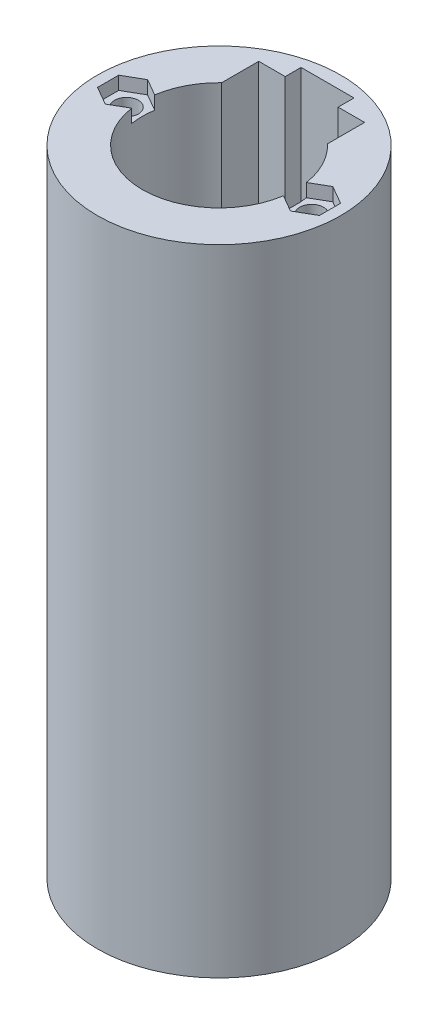
ISO-10303-21;
HEADER;
FILE_DESCRIPTION(('STEP AP214'),'2;1');
FILE_NAME('part.step','',(''),(''),'','','');
FILE_SCHEMA(('AUTOMOTIVE_DESIGN { 1 0 10303 214 1 1 1 1 }'));
ENDSEC;
DATA;
#1=APPLICATION_CONTEXT('core data for automotive mechanical design processes');
#2=APPLICATION_PROTOCOL_DEFINITION('international standard','automotive_design',2000,#1);
#3=PRODUCT_CONTEXT('',#1,'mechanical');
#4=PRODUCT('Part','Part','',(#3));
#5=PRODUCT_RELATED_PRODUCT_CATEGORY('part','',(#4));
#6=PRODUCT_DEFINITION_FORMATION('','',#4);
#7=PRODUCT_DEFINITION_CONTEXT('part definition',#1,'design');
#8=PRODUCT_DEFINITION('design','',#6,#7);
#9=PRODUCT_DEFINITION_SHAPE('','',#8);
#10=(LENGTH_UNIT() NAMED_UNIT(*) SI_UNIT(.MILLI.,.METRE.));
#11=(NAMED_UNIT(*) PLANE_ANGLE_UNIT() SI_UNIT($,.RADIAN.));
#12=(NAMED_UNIT(*) SI_UNIT($,.STERADIAN.) SOLID_ANGLE_UNIT());
#13=UNCERTAINTY_MEASURE_WITH_UNIT(LENGTH_MEASURE(1.E-05),#10,'distance_accuracy_value','');
#14=(GEOMETRIC_REPRESENTATION_CONTEXT(3) GLOBAL_UNCERTAINTY_ASSIGNED_CONTEXT((#13)) GLOBAL_UNIT_ASSIGNED_CONTEXT((#10,
#11,#12)) REPRESENTATION_CONTEXT('',''));
#15=CARTESIAN_POINT('',(0.,0.,0.));
#16=DIRECTION('',(0.,0.,1.));
#17=DIRECTION('',(1.,0.,0.));
#18=AXIS2_PLACEMENT_3D('',#15,#16,#17);
#19=CARTESIAN_POINT('',(-10.,95.,-17.5));
#20=DIRECTION('',(0.,0.,-1.));
#21=DIRECTION('',(-1.,0.,0.));
#22=AXIS2_PLACEMENT_3D('',#19,#20,#21);
#23=PLANE('',#22);
#24=DIRECTION('',(-1.,0.,0.));
#25=VECTOR('',#24,1.);
#26=CARTESIAN_POINT('',(-10.,95.,-17.5));
#27=LINE('',#26,#25);
#28=CARTESIAN_POINT('',(-5.,95.,-17.5));
#29=VERTEX_POINT('',#28);
#30=CARTESIAN_POINT('',(-10.,95.,-17.5));
#31=VERTEX_POINT('',#30);
#32=EDGE_CURVE('E197',#29,#31,#27,.T.);
#33=ORIENTED_EDGE('',*,*,#32,.F.);
#34=DIRECTION('',(0.,1.,0.));
#35=VECTOR('',#34,1.);
#36=CARTESIAN_POINT('',(-5.,95.,-17.5));
#37=LINE('',#36,#35);
#38=CARTESIAN_POINT('',(-5.,120.,-17.5));
#39=VERTEX_POINT('',#38);
#40=EDGE_CURVE('E207',#29,#39,#37,.T.);
#41=ORIENTED_EDGE('',*,*,#40,.T.);
#42=DIRECTION('',(-1.,0.,0.));
#43=VECTOR('',#42,1.);
#44=CARTESIAN_POINT('',(-10.,120.,-17.5));
#45=LINE('',#44,#43);
#46=CARTESIAN_POINT('',(-10.,120.,-17.5));
#47=VERTEX_POINT('',#46);
#48=EDGE_CURVE('E206',#39,#47,#45,.T.);
#49=ORIENTED_EDGE('',*,*,#48,.T.);
#50=DIRECTION('',(0.,1.,0.));
#51=VECTOR('',#50,1.);
#52=CARTESIAN_POINT('',(-10.,95.,-17.5));
#53=LINE('',#52,#51);
#54=EDGE_CURVE('E216',#31,#47,#53,.T.);
#55=ORIENTED_EDGE('',*,*,#54,.F.);
#56=EDGE_LOOP('',(#33,#41,#49,#55));
#57=FACE_BOUND('',#56,.T.);
#58=ADVANCED_FACE('F33',(#57),#23,.F.);
#59=CARTESIAN_POINT('',(0.,0.,0.));
#60=DIRECTION('',(0.,1.,0.));
#61=DIRECTION('',(0.,0.,1.));
#62=AXIS2_PLACEMENT_3D('',#59,#60,#61);
#63=CYLINDRICAL_SURFACE('',#62,14.5);
#64=CARTESIAN_POINT('',(0.,95.,0.));
#65=DIRECTION('',(0.,-1.,0.));
#66=DIRECTION('',(0.,0.,1.));
#67=AXIS2_PLACEMENT_3D('',#64,#65,#66);
#68=CIRCLE('',#67,14.5);
#69=CARTESIAN_POINT('',(-10.,95.,-10.5));
#70=VERTEX_POINT('',#69);
#71=CARTESIAN_POINT('',(10.,95.,-10.5));
#72=VERTEX_POINT('',#71);
#73=EDGE_CURVE('E211',#70,#72,#68,.T.);
#74=ORIENTED_EDGE('',*,*,#73,.F.);
#75=DIRECTION('',(0.,1.,0.));
#76=VECTOR('',#75,1.);
#77=CARTESIAN_POINT('',(-10.,95.,-10.5));
#78=LINE('',#77,#76);
#79=CARTESIAN_POINT('',(-10.,120.,-10.5));
#80=VERTEX_POINT('',#79);
#81=EDGE_CURVE('E212',#70,#80,#78,.T.);
#82=ORIENTED_EDGE('',*,*,#81,.T.);
#83=CARTESIAN_POINT('',(0.,120.,0.));
#84=DIRECTION('',(0.,1.,0.));
#85=DIRECTION('',(0.,0.,1.));
#86=AXIS2_PLACEMENT_3D('',#83,#84,#85);
#87=CIRCLE('',#86,14.5);
#88=CARTESIAN_POINT('',(-14.3361933401723,120.,-2.17337537328456));
#89=VERTEX_POINT('',#88);
#90=EDGE_CURVE('E300',#80,#89,#87,.T.);
#91=ORIENTED_EDGE('',*,*,#90,.T.);
#92=DIRECTION('',(0.,1.,0.));
#93=VECTOR('',#92,1.);
#94=CARTESIAN_POINT('',(-14.3361933401723,0.,-2.17337537328456));
#95=LINE('',#94,#93);
#96=CARTESIAN_POINT('',(-14.3361933401723,117.5,-2.17337537328456));
#97=VERTEX_POINT('',#96);
#98=EDGE_CURVE('E322',#89,#97,#95,.F.);
#99=ORIENTED_EDGE('',*,*,#98,.T.);
#100=CARTESIAN_POINT('',(0.,117.5,0.));
#101=DIRECTION('',(0.,1.,0.));
#102=DIRECTION('',(0.,0.,1.));
#103=AXIS2_PLACEMENT_3D('',#100,#101,#102);
#104=CIRCLE('',#103,14.5);
#105=CARTESIAN_POINT('',(-14.3361933401723,117.5,2.17337537328456));
#106=VERTEX_POINT('',#105);
#107=EDGE_CURVE('E315',#106,#97,#104,.F.);
#108=ORIENTED_EDGE('',*,*,#107,.F.);
#109=DIRECTION('',(0.,1.,0.));
#110=VECTOR('',#109,1.);
#111=CARTESIAN_POINT('',(-14.3361933401723,0.,2.17337537328456));
#112=LINE('',#111,#110);
#113=CARTESIAN_POINT('',(-14.3361933401723,120.,2.17337537328456));
#114=VERTEX_POINT('',#113);
#115=EDGE_CURVE('E319',#106,#114,#112,.T.);
#116=ORIENTED_EDGE('',*,*,#115,.T.);
#117=CARTESIAN_POINT('',(14.3361933401723,120.,2.17337537328456));
#118=VERTEX_POINT('',#117);
#119=EDGE_CURVE('E307',#114,#118,#87,.T.);
#120=ORIENTED_EDGE('',*,*,#119,.T.);
#121=DIRECTION('',(0.,1.,0.));
#122=VECTOR('',#121,1.);
#123=CARTESIAN_POINT('',(14.3361933401723,0.,2.17337537328456));
#124=LINE('',#123,#122);
#125=CARTESIAN_POINT('',(14.3361933401723,117.5,2.17337537328456));
#126=VERTEX_POINT('',#125);
#127=EDGE_CURVE('E328',#118,#126,#124,.F.);
#128=ORIENTED_EDGE('',*,*,#127,.T.);
#129=CARTESIAN_POINT('',(0.,117.5,0.));
#130=DIRECTION('',(0.,-1.,0.));
#131=DIRECTION('',(0.,0.,-1.));
#132=AXIS2_PLACEMENT_3D('',#129,#130,#131);
#133=CIRCLE('',#132,14.5);
#134=CARTESIAN_POINT('',(14.3361933401723,117.5,-2.17337537328456));
#135=VERTEX_POINT('',#134);
#136=EDGE_CURVE('E325',#126,#135,#133,.F.);
#137=ORIENTED_EDGE('',*,*,#136,.T.);
#138=DIRECTION('',(0.,1.,0.));
#139=VECTOR('',#138,1.);
#140=CARTESIAN_POINT('',(14.3361933401723,0.,-2.17337537328456));
#141=LINE('',#140,#139);
#142=CARTESIAN_POINT('',(14.3361933401723,120.,-2.17337537328456));
#143=VERTEX_POINT('',#142);
#144=EDGE_CURVE('E42',#135,#143,#141,.T.);
#145=ORIENTED_EDGE('',*,*,#144,.T.);
#146=CARTESIAN_POINT('',(10.,120.,-10.5));
#147=VERTEX_POINT('',#146);
#148=EDGE_CURVE('E311',#143,#147,#87,.T.);
#149=ORIENTED_EDGE('',*,*,#148,.T.);
#150=DIRECTION('',(0.,1.,0.));
#151=VECTOR('',#150,1.);
#152=CARTESIAN_POINT('',(10.,95.,-10.5));
#153=LINE('',#152,#151);
#154=EDGE_CURVE('E57',#72,#147,#153,.T.);
#155=ORIENTED_EDGE('',*,*,#154,.F.);
#156=EDGE_LOOP('',(#74,#82,#91,#99,#108,#116,#120,#128,#137,#145,#149,#155));
#157=FACE_BOUND('',#156,.T.);
#158=CARTESIAN_POINT('',(0.,7.,0.));
#159=DIRECTION('',(0.,-1.,0.));
#160=DIRECTION('',(0.,0.,-1.));
#161=AXIS2_PLACEMENT_3D('',#158,#159,#160);
#162=CIRCLE('',#161,14.5);
#163=CARTESIAN_POINT('',(0.,7.,-14.5));
#164=VERTEX_POINT('',#163);
#165=EDGE_CURVE('E11',#164,#164,#162,.F.);
#166=ORIENTED_EDGE('',*,*,#165,.F.);
#167=EDGE_LOOP('',(#166));
#168=FACE_BOUND('',#167,.T.);
#169=ADVANCED_FACE('F337',(#157,#168),#63,.F.);
#170=CARTESIAN_POINT('',(0.,120.,0.));
#171=DIRECTION('',(0.,-1.,0.));
#172=DIRECTION('',(0.,0.,-1.));
#173=AXIS2_PLACEMENT_3D('',#170,#171,#172);
#174=CYLINDRICAL_SURFACE('',#173,23.);
#175=CARTESIAN_POINT('',(0.,120.,0.));
#176=DIRECTION('',(0.,1.,0.));
#177=DIRECTION('',(0.,0.,1.));
#178=AXIS2_PLACEMENT_3D('',#175,#176,#177);
#179=CIRCLE('',#178,23.);
#180=CARTESIAN_POINT('',(0.,120.,23.));
#181=VERTEX_POINT('',#180);
#182=EDGE_CURVE('E312',#181,#181,#179,.T.);
#183=ORIENTED_EDGE('',*,*,#182,.F.);
#184=EDGE_LOOP('',(#183));
#185=FACE_BOUND('',#184,.T.);
#186=CARTESIAN_POINT('',(0.,0.,0.));
#187=DIRECTION('',(0.,1.,0.));
#188=DIRECTION('',(0.,0.,1.));
#189=AXIS2_PLACEMENT_3D('',#186,#187,#188);
#190=CIRCLE('',#189,23.);
#191=CARTESIAN_POINT('',(0.,0.,23.));
#192=VERTEX_POINT('',#191);
#193=EDGE_CURVE('E310',#192,#192,#190,.T.);
#194=ORIENTED_EDGE('',*,*,#193,.T.);
#195=EDGE_LOOP('',(#194));
#196=FACE_BOUND('',#195,.T.);
#197=ADVANCED_FACE('F35',(#185,#196),#174,.T.);
#198=CARTESIAN_POINT('',(0.,120.,0.));
#199=DIRECTION('',(0.,1.,0.));
#200=DIRECTION('',(0.,0.,1.));
#201=AXIS2_PLACEMENT_3D('',#198,#199,#200);
#202=PLANE('',#201);
#203=DIRECTION('',(0.,0.,1.));
#204=VECTOR('',#203,1.);
#205=CARTESIAN_POINT('',(-5.,120.,-17.5));
#206=LINE('',#205,#204);
#207=CARTESIAN_POINT('',(-5.,120.,-20.5));
#208=VERTEX_POINT('',#207);
#209=EDGE_CURVE('E182',#208,#39,#206,.T.);
#210=ORIENTED_EDGE('',*,*,#209,.F.);
#211=DIRECTION('',(-1.,0.,0.));
#212=VECTOR('',#211,1.);
#213=CARTESIAN_POINT('',(-5.,120.,-20.5));
#214=LINE('',#213,#212);
#215=CARTESIAN_POINT('',(5.,120.,-20.5));
#216=VERTEX_POINT('',#215);
#217=EDGE_CURVE('E442',#216,#208,#214,.T.);
#218=ORIENTED_EDGE('',*,*,#217,.F.);
#219=DIRECTION('',(0.,0.,-1.));
#220=VECTOR('',#219,1.);
#221=CARTESIAN_POINT('',(5.,120.,-20.5));
#222=LINE('',#221,#220);
#223=CARTESIAN_POINT('',(5.,120.,-17.5));
#224=VERTEX_POINT('',#223);
#225=EDGE_CURVE('E451',#224,#216,#222,.T.);
#226=ORIENTED_EDGE('',*,*,#225,.F.);
#227=CARTESIAN_POINT('',(10.,120.,-17.5));
#228=VERTEX_POINT('',#227);
#229=EDGE_CURVE('E191',#228,#224,#45,.T.);
#230=ORIENTED_EDGE('',*,*,#229,.F.);
#231=DIRECTION('',(0.,0.,-1.));
#232=VECTOR('',#231,1.);
#233=CARTESIAN_POINT('',(10.,120.,-17.5));
#234=LINE('',#233,#232);
#235=EDGE_CURVE('E204',#147,#228,#234,.T.);
#236=ORIENTED_EDGE('',*,*,#235,.F.);
#237=ORIENTED_EDGE('',*,*,#148,.F.);
#238=DIRECTION('',(-0.866025403784439,0.,0.499999999999999));
#239=VECTOR('',#238,1.);
#240=CARTESIAN_POINT('',(14.0358983848622,120.,-2.));
#241=LINE('',#240,#239);
#242=CARTESIAN_POINT('',(17.5,120.,-4.));
#243=VERTEX_POINT('',#242);
#244=EDGE_CURVE('E240',#243,#143,#241,.T.);
#245=ORIENTED_EDGE('',*,*,#244,.F.);
#246=DIRECTION('',(-0.866025403784438,0.,-0.500000000000001));
#247=VECTOR('',#246,1.);
#248=CARTESIAN_POINT('',(17.5,120.,-4.));
#249=LINE('',#248,#247);
#250=CARTESIAN_POINT('',(20.9641016151377,120.,-1.99999999999998));
#251=VERTEX_POINT('',#250);
#252=EDGE_CURVE('E259',#251,#243,#249,.T.);
#253=ORIENTED_EDGE('',*,*,#252,.F.);
#254=DIRECTION('',(0.,0.,-1.));
#255=VECTOR('',#254,1.);
#256=CARTESIAN_POINT('',(20.9641016151377,120.,-1.99999999999998));
#257=LINE('',#256,#255);
#258=CARTESIAN_POINT('',(20.9641016151377,120.,2.00000000000001));
#259=VERTEX_POINT('',#258);
#260=EDGE_CURVE('E256',#259,#251,#257,.T.);
#261=ORIENTED_EDGE('',*,*,#260,.F.);
#262=DIRECTION('',(0.866025403784439,0.,-0.499999999999999));
#263=VECTOR('',#262,1.);
#264=CARTESIAN_POINT('',(20.9641016151377,120.,2.00000000000001));
#265=LINE('',#264,#263);
#266=CARTESIAN_POINT('',(17.5,120.,4.00000000000001));
#267=VERTEX_POINT('',#266);
#268=EDGE_CURVE('E253',#267,#259,#265,.T.);
#269=ORIENTED_EDGE('',*,*,#268,.F.);
#270=DIRECTION('',(0.866025403784438,0.,0.500000000000001));
#271=VECTOR('',#270,1.);
#272=CARTESIAN_POINT('',(17.5,120.,4.00000000000001));
#273=LINE('',#272,#271);
#274=EDGE_CURVE('E234',#118,#267,#273,.T.);
#275=ORIENTED_EDGE('',*,*,#274,.F.);
#276=ORIENTED_EDGE('',*,*,#119,.F.);
#277=DIRECTION('',(0.866025403784438,0.,-0.500000000000001));
#278=VECTOR('',#277,1.);
#279=CARTESIAN_POINT('',(-17.5,120.,4.00000000000001));
#280=LINE('',#279,#278);
#281=CARTESIAN_POINT('',(-17.5,120.,4.00000000000001));
#282=VERTEX_POINT('',#281);
#283=EDGE_CURVE('E292',#282,#114,#280,.T.);
#284=ORIENTED_EDGE('',*,*,#283,.F.);
#285=DIRECTION('',(0.866025403784439,0.,0.499999999999999));
#286=VECTOR('',#285,1.);
#287=CARTESIAN_POINT('',(-20.9641016151377,120.,2.00000000000001));
#288=LINE('',#287,#286);
#289=CARTESIAN_POINT('',(-20.9641016151377,120.,2.00000000000001));
#290=VERTEX_POINT('',#289);
#291=EDGE_CURVE('E289',#290,#282,#288,.T.);
#292=ORIENTED_EDGE('',*,*,#291,.F.);
#293=DIRECTION('',(0.,0.,1.));
#294=VECTOR('',#293,1.);
#295=CARTESIAN_POINT('',(-20.9641016151377,120.,-1.99999999999998));
#296=LINE('',#295,#294);
#297=CARTESIAN_POINT('',(-20.9641016151377,120.,-1.99999999999998));
#298=VERTEX_POINT('',#297);
#299=EDGE_CURVE('E265',#298,#290,#296,.T.);
#300=ORIENTED_EDGE('',*,*,#299,.F.);
#301=DIRECTION('',(-0.866025403784438,0.,0.500000000000001));
#302=VECTOR('',#301,1.);
#303=CARTESIAN_POINT('',(-17.5,120.,-4.));
#304=LINE('',#303,#302);
#305=CARTESIAN_POINT('',(-17.5,120.,-4.));
#306=VERTEX_POINT('',#305);
#307=EDGE_CURVE('E276',#306,#298,#304,.T.);
#308=ORIENTED_EDGE('',*,*,#307,.F.);
#309=DIRECTION('',(-0.866025403784439,0.,-0.499999999999999));
#310=VECTOR('',#309,1.);
#311=CARTESIAN_POINT('',(-14.0358983848622,120.,-2.));
#312=LINE('',#311,#310);
#313=EDGE_CURVE('E294',#89,#306,#312,.T.);
#314=ORIENTED_EDGE('',*,*,#313,.F.);
#315=ORIENTED_EDGE('',*,*,#90,.F.);
#316=DIRECTION('',(0.,0.,1.));
#317=VECTOR('',#316,1.);
#318=CARTESIAN_POINT('',(-10.,120.,-10.5));
#319=LINE('',#318,#317);
#320=EDGE_CURVE('E209',#47,#80,#319,.T.);
#321=ORIENTED_EDGE('',*,*,#320,.F.);
#322=ORIENTED_EDGE('',*,*,#48,.F.);
#323=EDGE_LOOP('',(#210,#218,#226,#230,#236,#237,#245,#253,#261,#269,#275,#276,#284,#292,#300,
#308,#314,#315,#321,#322));
#324=FACE_BOUND('',#323,.T.);
#325=ORIENTED_EDGE('',*,*,#182,.T.);
#326=EDGE_LOOP('',(#325));
#327=FACE_BOUND('',#326,.T.);
#328=ADVANCED_FACE('F344',(#324,#327),#202,.T.);
#329=CARTESIAN_POINT('',(0.,0.,0.));
#330=DIRECTION('',(0.,1.,0.));
#331=DIRECTION('',(0.,0.,1.));
#332=AXIS2_PLACEMENT_3D('',#329,#330,#331);
#333=PLANE('',#332);
#334=CARTESIAN_POINT('',(0.,0.,0.));
#335=DIRECTION('',(0.,-1.,0.));
#336=DIRECTION('',(0.,0.,-1.));
#337=AXIS2_PLACEMENT_3D('',#334,#335,#336);
#338=CIRCLE('',#337,4.);
#339=CARTESIAN_POINT('',(0.,0.,-4.));
#340=VERTEX_POINT('',#339);
#341=EDGE_CURVE('E215',#340,#340,#338,.T.);
#342=ORIENTED_EDGE('',*,*,#341,.F.);
#343=EDGE_LOOP('',(#342));
#344=FACE_BOUND('',#343,.T.);
#345=ORIENTED_EDGE('',*,*,#193,.F.);
#346=EDGE_LOOP('',(#345));
#347=FACE_BOUND('',#346,.T.);
#348=ADVANCED_FACE('F490',(#344,#347),#333,.F.);
#349=CARTESIAN_POINT('',(-14.0358983848622,117.5,-2.));
#350=DIRECTION('',(0.499999999999999,0.,-0.866025403784439));
#351=DIRECTION('',(-0.866025403784439,0.,-0.499999999999999));
#352=AXIS2_PLACEMENT_3D('',#349,#350,#351);
#353=PLANE('',#352);
#354=ORIENTED_EDGE('',*,*,#313,.T.);
#355=DIRECTION('',(0.,1.,0.));
#356=VECTOR('',#355,1.);
#357=CARTESIAN_POINT('',(-17.5,117.5,-4.));
#358=LINE('',#357,#356);
#359=CARTESIAN_POINT('',(-17.5,117.5,-4.));
#360=VERTEX_POINT('',#359);
#361=EDGE_CURVE('E301',#360,#306,#358,.T.);
#362=ORIENTED_EDGE('',*,*,#361,.F.);
#363=DIRECTION('',(-0.866025403784439,0.,-0.499999999999999));
#364=VECTOR('',#363,1.);
#365=CARTESIAN_POINT('',(-14.0358983848622,117.5,-2.));
#366=LINE('',#365,#364);
#367=EDGE_CURVE('E281',#97,#360,#366,.T.);
#368=ORIENTED_EDGE('',*,*,#367,.F.);
#369=ORIENTED_EDGE('',*,*,#98,.F.);
#370=EDGE_LOOP('',(#354,#362,#368,#369));
#371=FACE_BOUND('',#370,.T.);
#372=ADVANCED_FACE('F354',(#371),#353,.F.);
#373=CARTESIAN_POINT('',(-17.5,117.5,4.00000000000001));
#374=DIRECTION('',(0.500000000000001,0.,0.866025403784438));
#375=DIRECTION('',(0.866025403784438,0.,-0.500000000000001));
#376=AXIS2_PLACEMENT_3D('',#373,#374,#375);
#377=PLANE('',#376);
#378=DIRECTION('',(0.866025403784438,0.,-0.500000000000001));
#379=VECTOR('',#378,1.);
#380=CARTESIAN_POINT('',(-17.5,117.5,4.00000000000001));
#381=LINE('',#380,#379);
#382=CARTESIAN_POINT('',(-17.5,117.5,4.00000000000001));
#383=VERTEX_POINT('',#382);
#384=EDGE_CURVE('E279',#383,#106,#381,.T.);
#385=ORIENTED_EDGE('',*,*,#384,.F.);
#386=DIRECTION('',(0.,1.,0.));
#387=VECTOR('',#386,1.);
#388=CARTESIAN_POINT('',(-17.5,117.5,4.00000000000001));
#389=LINE('',#388,#387);
#390=EDGE_CURVE('E304',#383,#282,#389,.T.);
#391=ORIENTED_EDGE('',*,*,#390,.T.);
#392=ORIENTED_EDGE('',*,*,#283,.T.);
#393=ORIENTED_EDGE('',*,*,#115,.F.);
#394=EDGE_LOOP('',(#385,#391,#392,#393));
#395=FACE_BOUND('',#394,.T.);
#396=ADVANCED_FACE('F639',(#395),#377,.F.);
#397=CARTESIAN_POINT('',(0.,117.5,0.));
#398=DIRECTION('',(0.,1.,0.));
#399=DIRECTION('',(0.,0.,1.));
#400=AXIS2_PLACEMENT_3D('',#397,#398,#399);
#401=PLANE('',#400);
#402=CARTESIAN_POINT('',(-17.5,117.5,0.));
#403=DIRECTION('',(0.,1.,0.));
#404=DIRECTION('',(0.,0.,1.));
#405=AXIS2_PLACEMENT_3D('',#402,#403,#404);
#406=CIRCLE('',#405,2.25);
#407=CARTESIAN_POINT('',(-17.5,117.5,2.24999999999999));
#408=VERTEX_POINT('',#407);
#409=EDGE_CURVE('E227',#408,#408,#406,.T.);
#410=ORIENTED_EDGE('',*,*,#409,.F.);
#411=EDGE_LOOP('',(#410));
#412=FACE_BOUND('',#411,.T.);
#413=ORIENTED_EDGE('',*,*,#107,.T.);
#414=ORIENTED_EDGE('',*,*,#367,.T.);
#415=DIRECTION('',(-0.866025403784438,0.,0.500000000000001));
#416=VECTOR('',#415,1.);
#417=CARTESIAN_POINT('',(-17.5,117.5,-4.));
#418=LINE('',#417,#416);
#419=CARTESIAN_POINT('',(-20.9641016151377,117.5,-1.99999999999998));
#420=VERTEX_POINT('',#419);
#421=EDGE_CURVE('E283',#360,#420,#418,.T.);
#422=ORIENTED_EDGE('',*,*,#421,.T.);
#423=DIRECTION('',(0.,0.,1.));
#424=VECTOR('',#423,1.);
#425=CARTESIAN_POINT('',(-20.9641016151377,117.5,-1.99999999999998));
#426=LINE('',#425,#424);
#427=CARTESIAN_POINT('',(-20.9641016151377,117.5,2.00000000000001));
#428=VERTEX_POINT('',#427);
#429=EDGE_CURVE('E272',#420,#428,#426,.T.);
#430=ORIENTED_EDGE('',*,*,#429,.T.);
#431=DIRECTION('',(0.866025403784439,0.,0.499999999999999));
#432=VECTOR('',#431,1.);
#433=CARTESIAN_POINT('',(-20.9641016151377,117.5,2.00000000000001));
#434=LINE('',#433,#432);
#435=EDGE_CURVE('E275',#428,#383,#434,.T.);
#436=ORIENTED_EDGE('',*,*,#435,.T.);
#437=ORIENTED_EDGE('',*,*,#384,.T.);
#438=EDGE_LOOP('',(#413,#414,#422,#430,#436,#437));
#439=FACE_BOUND('',#438,.T.);
#440=ADVANCED_FACE('F364',(#412,#439),#401,.T.);
#441=CARTESIAN_POINT('',(-20.9641016151377,117.5,-1.99999999999998));
#442=DIRECTION('',(-1.,0.,0.));
#443=DIRECTION('',(0.,0.,1.));
#444=AXIS2_PLACEMENT_3D('',#441,#442,#443);
#445=PLANE('',#444);
#446=ORIENTED_EDGE('',*,*,#299,.T.);
#447=DIRECTION('',(0.,1.,0.));
#448=VECTOR('',#447,1.);
#449=CARTESIAN_POINT('',(-20.9641016151377,117.5,2.00000000000001));
#450=LINE('',#449,#448);
#451=EDGE_CURVE('E286',#428,#290,#450,.T.);
#452=ORIENTED_EDGE('',*,*,#451,.F.);
#453=ORIENTED_EDGE('',*,*,#429,.F.);
#454=DIRECTION('',(0.,1.,0.));
#455=VECTOR('',#454,1.);
#456=CARTESIAN_POINT('',(-20.9641016151377,117.5,-1.99999999999998));
#457=LINE('',#456,#455);
#458=EDGE_CURVE('E298',#420,#298,#457,.T.);
#459=ORIENTED_EDGE('',*,*,#458,.T.);
#460=EDGE_LOOP('',(#446,#452,#453,#459));
#461=FACE_BOUND('',#460,.T.);
#462=ADVANCED_FACE('F623',(#461),#445,.F.);
#463=CARTESIAN_POINT('',(-17.5,117.5,-4.));
#464=DIRECTION('',(-0.500000000000001,0.,-0.866025403784438));
#465=DIRECTION('',(-0.866025403784438,0.,0.500000000000001));
#466=AXIS2_PLACEMENT_3D('',#463,#464,#465);
#467=PLANE('',#466);
#468=ORIENTED_EDGE('',*,*,#307,.T.);
#469=ORIENTED_EDGE('',*,*,#458,.F.);
#470=ORIENTED_EDGE('',*,*,#421,.F.);
#471=ORIENTED_EDGE('',*,*,#361,.T.);
#472=EDGE_LOOP('',(#468,#469,#470,#471));
#473=FACE_BOUND('',#472,.T.);
#474=ADVANCED_FACE('F360',(#473),#467,.F.);
#475=CARTESIAN_POINT('',(-20.9641016151377,117.5,2.00000000000001));
#476=DIRECTION('',(-0.499999999999999,0.,0.866025403784439));
#477=DIRECTION('',(0.866025403784439,0.,0.499999999999999));
#478=AXIS2_PLACEMENT_3D('',#475,#476,#477);
#479=PLANE('',#478);
#480=ORIENTED_EDGE('',*,*,#291,.T.);
#481=ORIENTED_EDGE('',*,*,#390,.F.);
#482=ORIENTED_EDGE('',*,*,#435,.F.);
#483=ORIENTED_EDGE('',*,*,#451,.T.);
#484=EDGE_LOOP('',(#480,#481,#482,#483));
#485=FACE_BOUND('',#484,.T.);
#486=ADVANCED_FACE('F607',(#485),#479,.F.);
#487=CARTESIAN_POINT('',(14.0358983848622,117.5,-2.));
#488=DIRECTION('',(-0.499999999999999,0.,-0.866025403784439));
#489=DIRECTION('',(-0.866025403784439,0.,0.499999999999999));
#490=AXIS2_PLACEMENT_3D('',#487,#488,#489);
#491=PLANE('',#490);
#492=DIRECTION('',(-0.866025403784439,0.,0.499999999999999));
#493=VECTOR('',#492,1.);
#494=CARTESIAN_POINT('',(14.0358983848622,117.5,-2.));
#495=LINE('',#494,#493);
#496=CARTESIAN_POINT('',(17.5,117.5,-4.));
#497=VERTEX_POINT('',#496);
#498=EDGE_CURVE('E249',#497,#135,#495,.T.);
#499=ORIENTED_EDGE('',*,*,#498,.F.);
#500=DIRECTION('',(0.,1.,0.));
#501=VECTOR('',#500,1.);
#502=CARTESIAN_POINT('',(17.5,117.5,-4.));
#503=LINE('',#502,#501);
#504=EDGE_CURVE('E263',#497,#243,#503,.T.);
#505=ORIENTED_EDGE('',*,*,#504,.T.);
#506=ORIENTED_EDGE('',*,*,#244,.T.);
#507=ORIENTED_EDGE('',*,*,#144,.F.);
#508=EDGE_LOOP('',(#499,#505,#506,#507));
#509=FACE_BOUND('',#508,.T.);
#510=ADVANCED_FACE('F384',(#509),#491,.F.);
#511=CARTESIAN_POINT('',(17.5,117.5,4.00000000000001));
#512=DIRECTION('',(-0.500000000000001,0.,0.866025403784438));
#513=DIRECTION('',(0.866025403784438,0.,0.500000000000001));
#514=AXIS2_PLACEMENT_3D('',#511,#512,#513);
#515=PLANE('',#514);
#516=ORIENTED_EDGE('',*,*,#274,.T.);
#517=DIRECTION('',(0.,1.,0.));
#518=VECTOR('',#517,1.);
#519=CARTESIAN_POINT('',(17.5,117.5,4.00000000000001));
#520=LINE('',#519,#518);
#521=CARTESIAN_POINT('',(17.5,117.5,4.00000000000001));
#522=VERTEX_POINT('',#521);
#523=EDGE_CURVE('E251',#522,#267,#520,.T.);
#524=ORIENTED_EDGE('',*,*,#523,.F.);
#525=DIRECTION('',(0.866025403784438,0.,0.500000000000001));
#526=VECTOR('',#525,1.);
#527=CARTESIAN_POINT('',(17.5,117.5,4.00000000000001));
#528=LINE('',#527,#526);
#529=EDGE_CURVE('E237',#126,#522,#528,.T.);
#530=ORIENTED_EDGE('',*,*,#529,.F.);
#531=ORIENTED_EDGE('',*,*,#127,.F.);
#532=EDGE_LOOP('',(#516,#524,#530,#531));
#533=FACE_BOUND('',#532,.T.);
#534=ADVANCED_FACE('F375',(#533),#515,.F.);
#535=CARTESIAN_POINT('',(0.,117.5,0.));
#536=DIRECTION('',(0.,-1.,0.));
#537=DIRECTION('',(0.,0.,-1.));
#538=AXIS2_PLACEMENT_3D('',#535,#536,#537);
#539=PLANE('',#538);
#540=CARTESIAN_POINT('',(17.5,117.5,0.));
#541=DIRECTION('',(0.,1.,0.));
#542=DIRECTION('',(0.,0.,-1.));
#543=AXIS2_PLACEMENT_3D('',#540,#541,#542);
#544=CIRCLE('',#543,2.25);
#545=CARTESIAN_POINT('',(17.5,117.5,-2.25));
#546=VERTEX_POINT('',#545);
#547=EDGE_CURVE('E228',#546,#546,#544,.T.);
#548=ORIENTED_EDGE('',*,*,#547,.F.);
#549=EDGE_LOOP('',(#548));
#550=FACE_BOUND('',#549,.T.);
#551=ORIENTED_EDGE('',*,*,#529,.T.);
#552=DIRECTION('',(0.866025403784439,0.,-0.499999999999999));
#553=VECTOR('',#552,1.);
#554=CARTESIAN_POINT('',(20.9641016151377,117.5,2.00000000000001));
#555=LINE('',#554,#553);
#556=CARTESIAN_POINT('',(20.9641016151377,117.5,2.00000000000001));
#557=VERTEX_POINT('',#556);
#558=EDGE_CURVE('E239',#522,#557,#555,.T.);
#559=ORIENTED_EDGE('',*,*,#558,.T.);
#560=DIRECTION('',(0.,0.,-1.));
#561=VECTOR('',#560,1.);
#562=CARTESIAN_POINT('',(20.9641016151377,117.5,-1.99999999999998));
#563=LINE('',#562,#561);
#564=CARTESIAN_POINT('',(20.9641016151377,117.5,-1.99999999999998));
#565=VERTEX_POINT('',#564);
#566=EDGE_CURVE('E243',#557,#565,#563,.T.);
#567=ORIENTED_EDGE('',*,*,#566,.T.);
#568=DIRECTION('',(-0.866025403784438,0.,-0.500000000000001));
#569=VECTOR('',#568,1.);
#570=CARTESIAN_POINT('',(17.5,117.5,-4.));
#571=LINE('',#570,#569);
#572=EDGE_CURVE('E246',#565,#497,#571,.T.);
#573=ORIENTED_EDGE('',*,*,#572,.T.);
#574=ORIENTED_EDGE('',*,*,#498,.T.);
#575=ORIENTED_EDGE('',*,*,#136,.F.);
#576=EDGE_LOOP('',(#551,#559,#567,#573,#574,#575));
#577=FACE_BOUND('',#576,.T.);
#578=ADVANCED_FACE('F382',(#550,#577),#539,.F.);
#579=CARTESIAN_POINT('',(17.5,117.5,-4.));
#580=DIRECTION('',(0.500000000000001,0.,-0.866025403784438));
#581=DIRECTION('',(-0.866025403784438,0.,-0.500000000000001));
#582=AXIS2_PLACEMENT_3D('',#579,#580,#581);
#583=PLANE('',#582);
#584=ORIENTED_EDGE('',*,*,#252,.T.);
#585=ORIENTED_EDGE('',*,*,#504,.F.);
#586=ORIENTED_EDGE('',*,*,#572,.F.);
#587=DIRECTION('',(0.,1.,0.));
#588=VECTOR('',#587,1.);
#589=CARTESIAN_POINT('',(20.9641016151377,117.5,-1.99999999999998));
#590=LINE('',#589,#588);
#591=EDGE_CURVE('E266',#565,#251,#590,.T.);
#592=ORIENTED_EDGE('',*,*,#591,.T.);
#593=EDGE_LOOP('',(#584,#585,#586,#592));
#594=FACE_BOUND('',#593,.T.);
#595=ADVANCED_FACE('F386',(#594),#583,.F.);
#596=CARTESIAN_POINT('',(20.9641016151377,117.5,-1.99999999999998));
#597=DIRECTION('',(1.,0.,0.));
#598=DIRECTION('',(0.,0.,-1.));
#599=AXIS2_PLACEMENT_3D('',#596,#597,#598);
#600=PLANE('',#599);
#601=ORIENTED_EDGE('',*,*,#260,.T.);
#602=ORIENTED_EDGE('',*,*,#591,.F.);
#603=ORIENTED_EDGE('',*,*,#566,.F.);
#604=DIRECTION('',(0.,1.,0.));
#605=VECTOR('',#604,1.);
#606=CARTESIAN_POINT('',(20.9641016151377,117.5,2.00000000000001));
#607=LINE('',#606,#605);
#608=EDGE_CURVE('E268',#557,#259,#607,.T.);
#609=ORIENTED_EDGE('',*,*,#608,.T.);
#610=EDGE_LOOP('',(#601,#602,#603,#609));
#611=FACE_BOUND('',#610,.T.);
#612=ADVANCED_FACE('F388',(#611),#600,.F.);
#613=CARTESIAN_POINT('',(20.9641016151377,117.5,2.00000000000001));
#614=DIRECTION('',(0.499999999999999,0.,0.866025403784439));
#615=DIRECTION('',(0.866025403784439,0.,-0.499999999999999));
#616=AXIS2_PLACEMENT_3D('',#613,#614,#615);
#617=PLANE('',#616);
#618=ORIENTED_EDGE('',*,*,#268,.T.);
#619=ORIENTED_EDGE('',*,*,#608,.F.);
#620=ORIENTED_EDGE('',*,*,#558,.F.);
#621=ORIENTED_EDGE('',*,*,#523,.T.);
#622=EDGE_LOOP('',(#618,#619,#620,#621));
#623=FACE_BOUND('',#622,.T.);
#624=ADVANCED_FACE('F379',(#623),#617,.F.);
#625=CARTESIAN_POINT('',(-17.5,107.5,0.));
#626=DIRECTION('',(0.,1.,0.));
#627=DIRECTION('',(0.,0.,1.));
#628=AXIS2_PLACEMENT_3D('',#625,#626,#627);
#629=CYLINDRICAL_SURFACE('',#628,2.25);
#630=CARTESIAN_POINT('',(-17.5,107.5,0.));
#631=DIRECTION('',(0.,1.,0.));
#632=DIRECTION('',(0.,0.,1.));
#633=AXIS2_PLACEMENT_3D('',#630,#631,#632);
#634=CIRCLE('',#633,2.25);
#635=CARTESIAN_POINT('',(-17.5,107.5,2.24999999999999));
#636=VERTEX_POINT('',#635);
#637=EDGE_CURVE('E231',#636,#636,#634,.T.);
#638=ORIENTED_EDGE('',*,*,#637,.F.);
#639=EDGE_LOOP('',(#638));
#640=FACE_BOUND('',#639,.T.);
#641=ORIENTED_EDGE('',*,*,#409,.T.);
#642=EDGE_LOOP('',(#641));
#643=FACE_BOUND('',#642,.T.);
#644=ADVANCED_FACE('F395',(#640,#643),#629,.F.);
#645=CARTESIAN_POINT('',(-17.5,107.5,0.));
#646=DIRECTION('',(0.,1.,0.));
#647=DIRECTION('',(0.,0.,1.));
#648=AXIS2_PLACEMENT_3D('',#645,#646,#647);
#649=PLANE('',#648);
#650=ORIENTED_EDGE('',*,*,#637,.T.);
#651=EDGE_LOOP('',(#650));
#652=FACE_BOUND('',#651,.T.);
#653=ADVANCED_FACE('F552',(#652),#649,.T.);
#654=CARTESIAN_POINT('',(17.5,107.5,0.));
#655=DIRECTION('',(0.,1.,0.));
#656=DIRECTION('',(0.,0.,1.));
#657=AXIS2_PLACEMENT_3D('',#654,#655,#656);
#658=CYLINDRICAL_SURFACE('',#657,2.25);
#659=CARTESIAN_POINT('',(17.5,107.5,0.));
#660=DIRECTION('',(0.,1.,0.));
#661=DIRECTION('',(0.,0.,-1.));
#662=AXIS2_PLACEMENT_3D('',#659,#660,#661);
#663=CIRCLE('',#662,2.25);
#664=CARTESIAN_POINT('',(17.5,107.5,-2.25));
#665=VERTEX_POINT('',#664);
#666=EDGE_CURVE('E224',#665,#665,#663,.T.);
#667=ORIENTED_EDGE('',*,*,#666,.F.);
#668=EDGE_LOOP('',(#667));
#669=FACE_BOUND('',#668,.T.);
#670=ORIENTED_EDGE('',*,*,#547,.T.);
#671=EDGE_LOOP('',(#670));
#672=FACE_BOUND('',#671,.T.);
#673=ADVANCED_FACE('F543',(#669,#672),#658,.F.);
#674=CARTESIAN_POINT('',(17.5,107.5,0.));
#675=DIRECTION('',(0.,-1.,0.));
#676=DIRECTION('',(0.,0.,-1.));
#677=AXIS2_PLACEMENT_3D('',#674,#675,#676);
#678=PLANE('',#677);
#679=ORIENTED_EDGE('',*,*,#666,.T.);
#680=EDGE_LOOP('',(#679));
#681=FACE_BOUND('',#680,.T.);
#682=ADVANCED_FACE('F521',(#681),#678,.F.);
#683=CARTESIAN_POINT('',(0.,7.,0.));
#684=DIRECTION('',(0.,-1.,0.));
#685=DIRECTION('',(0.,0.,-1.));
#686=AXIS2_PLACEMENT_3D('',#683,#684,#685);
#687=PLANE('',#686);
#688=CARTESIAN_POINT('',(0.,7.,0.));
#689=DIRECTION('',(0.,-1.,0.));
#690=DIRECTION('',(0.,0.,-1.));
#691=AXIS2_PLACEMENT_3D('',#688,#689,#690);
#692=CIRCLE('',#691,4.);
#693=CARTESIAN_POINT('',(0.,7.,-4.));
#694=VERTEX_POINT('',#693);
#695=EDGE_CURVE('E37',#694,#694,#692,.T.);
#696=ORIENTED_EDGE('',*,*,#695,.T.);
#697=EDGE_LOOP('',(#696));
#698=FACE_BOUND('',#697,.T.);
#699=ORIENTED_EDGE('',*,*,#165,.T.);
#700=EDGE_LOOP('',(#699));
#701=FACE_BOUND('',#700,.T.);
#702=ADVANCED_FACE('F420',(#698,#701),#687,.F.);
#703=CARTESIAN_POINT('',(0.,15.,0.));
#704=DIRECTION('',(0.,-1.,0.));
#705=DIRECTION('',(0.,0.,-1.));
#706=AXIS2_PLACEMENT_3D('',#703,#704,#705);
#707=CYLINDRICAL_SURFACE('',#706,4.);
#708=ORIENTED_EDGE('',*,*,#341,.T.);
#709=EDGE_LOOP('',(#708));
#710=FACE_BOUND('',#709,.T.);
#711=ORIENTED_EDGE('',*,*,#695,.F.);
#712=EDGE_LOOP('',(#711));
#713=FACE_BOUND('',#712,.T.);
#714=ADVANCED_FACE('F415',(#710,#713),#707,.F.);
#715=CARTESIAN_POINT('',(-10.,95.,-10.5));
#716=DIRECTION('',(-1.,0.,0.));
#717=DIRECTION('',(0.,0.,1.));
#718=AXIS2_PLACEMENT_3D('',#715,#716,#717);
#719=PLANE('',#718);
#720=ORIENTED_EDGE('',*,*,#320,.T.);
#721=ORIENTED_EDGE('',*,*,#81,.F.);
#722=DIRECTION('',(0.,0.,1.));
#723=VECTOR('',#722,1.);
#724=CARTESIAN_POINT('',(-10.,95.,-10.5));
#725=LINE('',#724,#723);
#726=EDGE_CURVE('E196',#31,#70,#725,.T.);
#727=ORIENTED_EDGE('',*,*,#726,.F.);
#728=ORIENTED_EDGE('',*,*,#54,.T.);
#729=EDGE_LOOP('',(#720,#721,#727,#728));
#730=FACE_BOUND('',#729,.T.);
#731=ADVANCED_FACE('F410',(#730),#719,.F.);
#732=ORIENTED_EDGE('',*,*,#229,.T.);
#733=DIRECTION('',(0.,1.,0.));
#734=VECTOR('',#733,1.);
#735=CARTESIAN_POINT('',(5.,95.,-17.5));
#736=LINE('',#735,#734);
#737=CARTESIAN_POINT('',(5.,95.,-17.5));
#738=VERTEX_POINT('',#737);
#739=EDGE_CURVE('E176',#738,#224,#736,.T.);
#740=ORIENTED_EDGE('',*,*,#739,.F.);
#741=CARTESIAN_POINT('',(10.,95.,-17.5));
#742=VERTEX_POINT('',#741);
#743=EDGE_CURVE('E188',#742,#738,#27,.T.);
#744=ORIENTED_EDGE('',*,*,#743,.F.);
#745=DIRECTION('',(0.,1.,0.));
#746=VECTOR('',#745,1.);
#747=CARTESIAN_POINT('',(10.,95.,-17.5));
#748=LINE('',#747,#746);
#749=EDGE_CURVE('E219',#742,#228,#748,.T.);
#750=ORIENTED_EDGE('',*,*,#749,.T.);
#751=EDGE_LOOP('',(#732,#740,#744,#750));
#752=FACE_BOUND('',#751,.T.);
#753=ADVANCED_FACE('F187',(#752),#23,.F.);
#754=CARTESIAN_POINT('',(10.,95.,-17.5));
#755=DIRECTION('',(1.,0.,0.));
#756=DIRECTION('',(0.,0.,-1.));
#757=AXIS2_PLACEMENT_3D('',#754,#755,#756);
#758=PLANE('',#757);
#759=ORIENTED_EDGE('',*,*,#235,.T.);
#760=ORIENTED_EDGE('',*,*,#749,.F.);
#761=DIRECTION('',(0.,0.,-1.));
#762=VECTOR('',#761,1.);
#763=CARTESIAN_POINT('',(10.,95.,-17.5));
#764=LINE('',#763,#762);
#765=EDGE_CURVE('E195',#72,#742,#764,.T.);
#766=ORIENTED_EDGE('',*,*,#765,.F.);
#767=ORIENTED_EDGE('',*,*,#154,.T.);
#768=EDGE_LOOP('',(#759,#760,#766,#767));
#769=FACE_BOUND('',#768,.T.);
#770=ADVANCED_FACE('F409',(#769),#758,.F.);
#771=CARTESIAN_POINT('',(0.,95.,0.));
#772=DIRECTION('',(0.,1.,0.));
#773=DIRECTION('',(0.,0.,1.));
#774=AXIS2_PLACEMENT_3D('',#771,#772,#773);
#775=PLANE('',#774);
#776=ORIENTED_EDGE('',*,*,#73,.T.);
#777=ORIENTED_EDGE('',*,*,#765,.T.);
#778=ORIENTED_EDGE('',*,*,#743,.T.);
#779=DIRECTION('',(0.,0.,-1.));
#780=VECTOR('',#779,1.);
#781=CARTESIAN_POINT('',(5.,95.,-20.5));
#782=LINE('',#781,#780);
#783=CARTESIAN_POINT('',(5.,95.,-20.5));
#784=VERTEX_POINT('',#783);
#785=EDGE_CURVE('E172',#738,#784,#782,.T.);
#786=ORIENTED_EDGE('',*,*,#785,.T.);
#787=DIRECTION('',(-1.,0.,0.));
#788=VECTOR('',#787,1.);
#789=CARTESIAN_POINT('',(-5.,95.,-20.5));
#790=LINE('',#789,#788);
#791=CARTESIAN_POINT('',(-5.,95.,-20.5));
#792=VERTEX_POINT('',#791);
#793=EDGE_CURVE('E181',#784,#792,#790,.T.);
#794=ORIENTED_EDGE('',*,*,#793,.T.);
#795=DIRECTION('',(0.,0.,1.));
#796=VECTOR('',#795,1.);
#797=CARTESIAN_POINT('',(-5.,95.,-17.5));
#798=LINE('',#797,#796);
#799=EDGE_CURVE('E49',#792,#29,#798,.T.);
#800=ORIENTED_EDGE('',*,*,#799,.T.);
#801=ORIENTED_EDGE('',*,*,#32,.T.);
#802=ORIENTED_EDGE('',*,*,#726,.T.);
#803=EDGE_LOOP('',(#776,#777,#778,#786,#794,#800,#801,#802));
#804=FACE_BOUND('',#803,.T.);
#805=ADVANCED_FACE('F194',(#804),#775,.T.);
#806=CARTESIAN_POINT('',(-5.,95.,-17.5));
#807=DIRECTION('',(-1.,0.,0.));
#808=DIRECTION('',(0.,0.,1.));
#809=AXIS2_PLACEMENT_3D('',#806,#807,#808);
#810=PLANE('',#809);
#811=ORIENTED_EDGE('',*,*,#209,.T.);
#812=ORIENTED_EDGE('',*,*,#40,.F.);
#813=ORIENTED_EDGE('',*,*,#799,.F.);
#814=DIRECTION('',(0.,1.,0.));
#815=VECTOR('',#814,1.);
#816=CARTESIAN_POINT('',(-5.,95.,-20.5));
#817=LINE('',#816,#815);
#818=EDGE_CURVE('E438',#792,#208,#817,.T.);
#819=ORIENTED_EDGE('',*,*,#818,.T.);
#820=EDGE_LOOP('',(#811,#812,#813,#819));
#821=FACE_BOUND('',#820,.T.);
#822=ADVANCED_FACE('F426',(#821),#810,.F.);
#823=CARTESIAN_POINT('',(-5.,95.,-20.5));
#824=DIRECTION('',(0.,0.,-1.));
#825=DIRECTION('',(-1.,0.,0.));
#826=AXIS2_PLACEMENT_3D('',#823,#824,#825);
#827=PLANE('',#826);
#828=ORIENTED_EDGE('',*,*,#217,.T.);
#829=ORIENTED_EDGE('',*,*,#818,.F.);
#830=ORIENTED_EDGE('',*,*,#793,.F.);
#831=DIRECTION('',(0.,1.,0.));
#832=VECTOR('',#831,1.);
#833=CARTESIAN_POINT('',(5.,95.,-20.5));
#834=LINE('',#833,#832);
#835=EDGE_CURVE('E178',#784,#216,#834,.T.);
#836=ORIENTED_EDGE('',*,*,#835,.T.);
#837=EDGE_LOOP('',(#828,#829,#830,#836));
#838=FACE_BOUND('',#837,.T.);
#839=ADVANCED_FACE('F429',(#838),#827,.F.);
#840=CARTESIAN_POINT('',(5.,95.,-20.5));
#841=DIRECTION('',(1.,0.,0.));
#842=DIRECTION('',(0.,0.,-1.));
#843=AXIS2_PLACEMENT_3D('',#840,#841,#842);
#844=PLANE('',#843);
#845=ORIENTED_EDGE('',*,*,#225,.T.);
#846=ORIENTED_EDGE('',*,*,#835,.F.);
#847=ORIENTED_EDGE('',*,*,#785,.F.);
#848=ORIENTED_EDGE('',*,*,#739,.T.);
#849=EDGE_LOOP('',(#845,#846,#847,#848));
#850=FACE_BOUND('',#849,.T.);
#851=ADVANCED_FACE('F175',(#850),#844,.F.);
#852=CLOSED_SHELL('',(#58,#169,#197,#328,#348,#372,#396,#440,#462,#474,#486,#510,#534,#578,#595,
#612,#624,#644,#653,#673,#682,#702,#714,#731,#753,#770,#805,#822,#839,#851));
#853=MANIFOLD_SOLID_BREP('B2',#852);
#854=ADVANCED_BREP_SHAPE_REPRESENTATION('',(#18,#853),#14);
#855=SHAPE_DEFINITION_REPRESENTATION(#9,#854);
ENDSEC;
END-ISO-10303-21;
